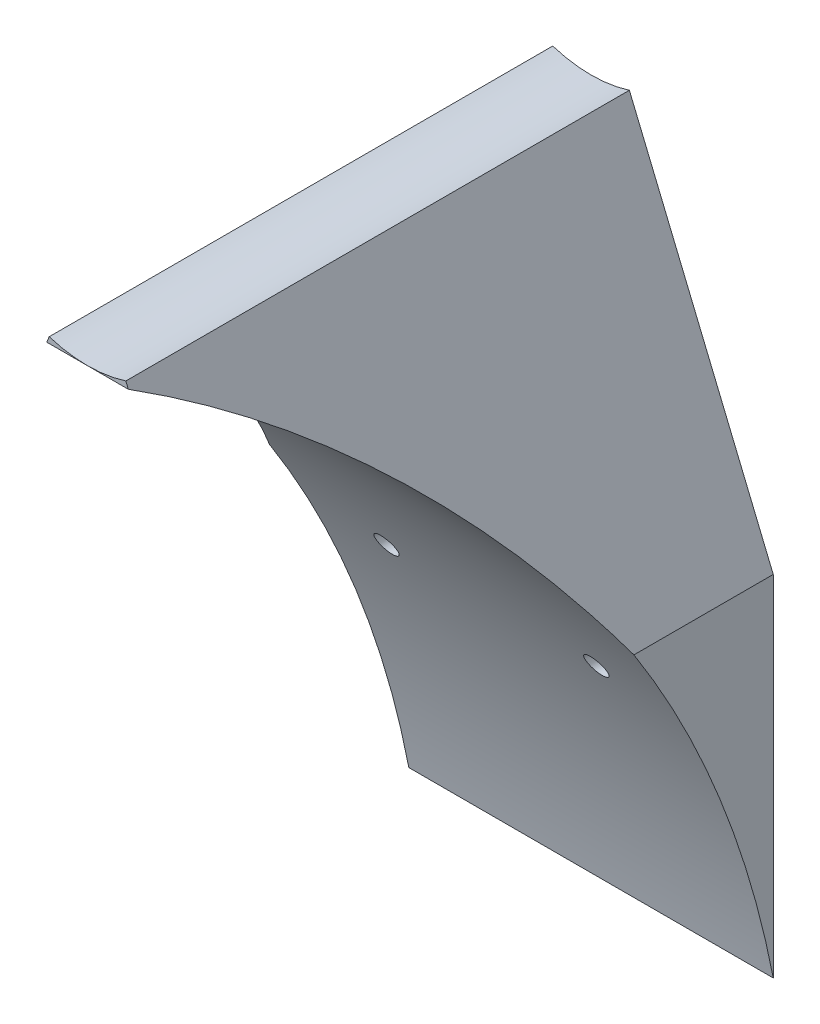
ISO-10303-21;
HEADER;
FILE_DESCRIPTION(('STEP AP214'),'2;1');
FILE_NAME('part.step','',(''),(''),'','','');
FILE_SCHEMA(('AUTOMOTIVE_DESIGN { 1 0 10303 214 1 1 1 1 }'));
ENDSEC;
DATA;
#1=APPLICATION_CONTEXT('core data for automotive mechanical design processes');
#2=APPLICATION_PROTOCOL_DEFINITION('international standard','automotive_design',2000,#1);
#3=PRODUCT_CONTEXT('',#1,'mechanical');
#4=PRODUCT('Part','Part','',(#3));
#5=PRODUCT_RELATED_PRODUCT_CATEGORY('part','',(#4));
#6=PRODUCT_DEFINITION_FORMATION('','',#4);
#7=PRODUCT_DEFINITION_CONTEXT('part definition',#1,'design');
#8=PRODUCT_DEFINITION('design','',#6,#7);
#9=PRODUCT_DEFINITION_SHAPE('','',#8);
#10=(LENGTH_UNIT() NAMED_UNIT(*) SI_UNIT(.MILLI.,.METRE.));
#11=(NAMED_UNIT(*) PLANE_ANGLE_UNIT() SI_UNIT($,.RADIAN.));
#12=(NAMED_UNIT(*) SI_UNIT($,.STERADIAN.) SOLID_ANGLE_UNIT());
#13=UNCERTAINTY_MEASURE_WITH_UNIT(LENGTH_MEASURE(1.E-05),#10,'distance_accuracy_value','');
#14=(GEOMETRIC_REPRESENTATION_CONTEXT(3) GLOBAL_UNCERTAINTY_ASSIGNED_CONTEXT((#13)) GLOBAL_UNIT_ASSIGNED_CONTEXT((#10,
#11,#12)) REPRESENTATION_CONTEXT('',''));
#15=CARTESIAN_POINT('',(0.,0.,0.));
#16=DIRECTION('',(0.,0.,1.));
#17=DIRECTION('',(1.,0.,0.));
#18=AXIS2_PLACEMENT_3D('',#15,#16,#17);
#19=CARTESIAN_POINT('',(0.,0.,76.2));
#20=DIRECTION('',(0.,0.,1.));
#21=DIRECTION('',(1.,0.,0.));
#22=AXIS2_PLACEMENT_3D('',#19,#20,#21);
#23=PLANE('',#22);
#24=CARTESIAN_POINT('',(0.,0.,76.2));
#25=DIRECTION('',(0.,0.,1.));
#26=DIRECTION('',(1.,0.,0.));
#27=AXIS2_PLACEMENT_3D('',#24,#25,#26);
#28=CIRCLE('',#27,19.05);
#29=CARTESIAN_POINT('',(0.,-19.05,76.2));
#30=VERTEX_POINT('',#29);
#31=CARTESIAN_POINT('',(-5.79810361486857,-18.1461977965426,76.2));
#32=VERTEX_POINT('',#31);
#33=EDGE_CURVE('E101',#30,#32,#28,.F.);
#34=ORIENTED_EDGE('',*,*,#33,.T.);
#35=DIRECTION('',(-0.382683432365091,-0.923879532511286,0.));
#36=VECTOR('',#35,1.);
#37=CARTESIAN_POINT('',(0.,-4.14833741348245,76.2));
#38=LINE('',#37,#36);
#39=CARTESIAN_POINT('',(-6.1724707452433,-19.05,76.2));
#40=VERTEX_POINT('',#39);
#41=EDGE_CURVE('E110',#32,#40,#38,.T.);
#42=ORIENTED_EDGE('',*,*,#41,.T.);
#43=DIRECTION('',(-1.,0.,0.));
#44=VECTOR('',#43,1.);
#45=CARTESIAN_POINT('',(156.950665084076,-19.05,76.2));
#46=LINE('',#45,#44);
#47=EDGE_CURVE('E186',#30,#40,#46,.T.);
#48=ORIENTED_EDGE('',*,*,#47,.F.);
#49=EDGE_LOOP('',(#34,#42,#48));
#50=FACE_BOUND('',#49,.T.);
#51=ADVANCED_FACE('F33',(#50),#23,.T.);
#52=CARTESIAN_POINT('',(27.5729775462199,-123.606903323708,76.2));
#53=DIRECTION('',(-1.,0.,0.));
#54=DIRECTION('',(0.,0.,1.));
#55=AXIS2_PLACEMENT_3D('',#52,#53,#54);
#56=PLANE('',#55);
#57=CARTESIAN_POINT('',(27.5729775462199,-152.600603318377,149.616594536232));
#58=DIRECTION('',(-1.,0.,0.));
#59=DIRECTION('',(0.,0.,1.));
#60=AXIS2_PLACEMENT_3D('',#57,#58,#59);
#61=CIRCLE('',#60,152.4);
#62=CARTESIAN_POINT('',(27.5729775462199,-70.7153937605752,21.0842155196007));
#63=VERTEX_POINT('',#62);
#64=CARTESIAN_POINT('',(27.5729775462199,-123.606903323708,0.));
#65=VERTEX_POINT('',#64);
#66=EDGE_CURVE('E190',#63,#65,#61,.T.);
#67=ORIENTED_EDGE('',*,*,#66,.T.);
#68=DIRECTION('',(0.,1.,0.));
#69=VECTOR('',#68,1.);
#70=CARTESIAN_POINT('',(27.5729775462199,-123.606903323708,0.));
#71=LINE('',#70,#69);
#72=CARTESIAN_POINT('',(27.5729775462199,-70.7153937605752,0.));
#73=VERTEX_POINT('',#72);
#74=EDGE_CURVE('E120',#65,#73,#71,.T.);
#75=ORIENTED_EDGE('',*,*,#74,.T.);
#76=DIRECTION('',(0.,0.,-1.));
#77=VECTOR('',#76,1.);
#78=CARTESIAN_POINT('',(27.5729775462199,-70.7153937605752,76.2));
#79=LINE('',#78,#77);
#80=EDGE_CURVE('E11',#63,#73,#79,.T.);
#81=ORIENTED_EDGE('',*,*,#80,.F.);
#82=EDGE_LOOP('',(#67,#75,#81));
#83=FACE_BOUND('',#82,.T.);
#84=ADVANCED_FACE('F35',(#83),#56,.F.);
#85=CARTESIAN_POINT('',(0.,-4.14833741348245,76.2));
#86=DIRECTION('',(-0.923879532511286,-0.382683432365091,0.));
#87=DIRECTION('',(0.382683432365091,-0.923879532511287,0.));
#88=AXIS2_PLACEMENT_3D('',#85,#86,#87);
#89=PLANE('',#88);
#90=DIRECTION('',(-0.382683432365091,0.923879532511287,0.));
#91=VECTOR('',#90,1.);
#92=CARTESIAN_POINT('',(0.,-4.14833741348245,0.));
#93=LINE('',#92,#91);
#94=CARTESIAN_POINT('',(5.79810361486859,-18.1461977965426,0.));
#95=VERTEX_POINT('',#94);
#96=EDGE_CURVE('E116',#73,#95,#93,.T.);
#97=ORIENTED_EDGE('',*,*,#96,.T.);
#98=DIRECTION('',(0.,0.,-1.));
#99=VECTOR('',#98,1.);
#100=CARTESIAN_POINT('',(5.79810361486859,-18.1461977965426,76.201));
#101=LINE('',#100,#99);
#102=CARTESIAN_POINT('',(5.79810361486859,-18.1461977965426,76.2));
#103=VERTEX_POINT('',#102);
#104=EDGE_CURVE('E55',#103,#95,#101,.T.);
#105=ORIENTED_EDGE('',*,*,#104,.F.);
#106=DIRECTION('',(-0.382683432365091,0.923879532511287,0.));
#107=VECTOR('',#106,1.);
#108=CARTESIAN_POINT('',(0.,-4.14833741348245,76.2));
#109=LINE('',#108,#107);
#110=CARTESIAN_POINT('',(6.17247074524332,-19.05,76.2));
#111=VERTEX_POINT('',#110);
#112=EDGE_CURVE('E118',#111,#103,#109,.T.);
#113=ORIENTED_EDGE('',*,*,#112,.F.);
#114=CARTESIAN_POINT('',(61.4909419028246,-152.600603318377,149.616594536232));
#115=DIRECTION('',(-0.923879532511286,-0.382683432365091,0.));
#116=DIRECTION('',(-0.382683432365091,0.923879532511287,0.));
#117=AXIS2_PLACEMENT_3D('',#114,#115,#116);
#118=ELLIPSE('',#117,164.956571324561,152.4);
#119=EDGE_CURVE('E189',#63,#111,#118,.F.);
#120=ORIENTED_EDGE('',*,*,#119,.F.);
#121=ORIENTED_EDGE('',*,*,#80,.T.);
#122=EDGE_LOOP('',(#97,#105,#113,#120,#121));
#123=FACE_BOUND('',#122,.T.);
#124=ADVANCED_FACE('F162',(#123),#89,.F.);
#125=CARTESIAN_POINT('',(-27.5729775462199,-70.7153937605752,76.2));
#126=DIRECTION('',(1.,0.,0.));
#127=DIRECTION('',(0.,1.,0.));
#128=AXIS2_PLACEMENT_3D('',#125,#126,#127);
#129=PLANE('',#128);
#130=CARTESIAN_POINT('',(-27.5729775462199,-152.600603318377,149.616594536232));
#131=DIRECTION('',(1.,0.,0.));
#132=DIRECTION('',(0.,1.,0.));
#133=AXIS2_PLACEMENT_3D('',#130,#131,#132);
#134=CIRCLE('',#133,152.4);
#135=CARTESIAN_POINT('',(-27.5729775462199,-123.606903323708,0.));
#136=VERTEX_POINT('',#135);
#137=CARTESIAN_POINT('',(-27.5729775462199,-70.7153937605753,21.0842155196007));
#138=VERTEX_POINT('',#137);
#139=EDGE_CURVE('E63',#136,#138,#134,.T.);
#140=ORIENTED_EDGE('',*,*,#139,.T.);
#141=DIRECTION('',(0.,0.,-1.));
#142=VECTOR('',#141,1.);
#143=CARTESIAN_POINT('',(-27.5729775462199,-70.7153937605752,76.2));
#144=LINE('',#143,#142);
#145=CARTESIAN_POINT('',(-27.5729775462199,-70.7153937605752,0.));
#146=VERTEX_POINT('',#145);
#147=EDGE_CURVE('E47',#138,#146,#144,.T.);
#148=ORIENTED_EDGE('',*,*,#147,.T.);
#149=DIRECTION('',(0.,-1.,0.));
#150=VECTOR('',#149,1.);
#151=CARTESIAN_POINT('',(-27.5729775462199,-70.7153937605752,0.));
#152=LINE('',#151,#150);
#153=EDGE_CURVE('E115',#146,#136,#152,.T.);
#154=ORIENTED_EDGE('',*,*,#153,.T.);
#155=EDGE_LOOP('',(#140,#148,#154));
#156=FACE_BOUND('',#155,.T.);
#157=ADVANCED_FACE('F166',(#156),#129,.F.);
#158=EDGE_CURVE('E178',#103,#30,#28,.F.);
#159=ORIENTED_EDGE('',*,*,#158,.T.);
#160=EDGE_CURVE('E181',#111,#30,#46,.T.);
#161=ORIENTED_EDGE('',*,*,#160,.F.);
#162=ORIENTED_EDGE('',*,*,#112,.T.);
#163=EDGE_LOOP('',(#159,#161,#162));
#164=FACE_BOUND('',#163,.T.);
#165=ADVANCED_FACE('F158',(#164),#23,.T.);
#166=CARTESIAN_POINT('',(0.,-4.14833741348245,76.2));
#167=DIRECTION('',(0.923879532511286,-0.382683432365091,0.));
#168=DIRECTION('',(0.382683432365091,0.923879532511287,0.));
#169=AXIS2_PLACEMENT_3D('',#166,#167,#168);
#170=PLANE('',#169);
#171=ORIENTED_EDGE('',*,*,#41,.F.);
#172=DIRECTION('',(0.,0.,-1.));
#173=VECTOR('',#172,1.);
#174=CARTESIAN_POINT('',(-5.79810361486857,-18.1461977965426,76.201));
#175=LINE('',#174,#173);
#176=CARTESIAN_POINT('',(-5.79810361486857,-18.1461977965426,0.));
#177=VERTEX_POINT('',#176);
#178=EDGE_CURVE('E95',#177,#32,#175,.F.);
#179=ORIENTED_EDGE('',*,*,#178,.F.);
#180=DIRECTION('',(-0.382683432365091,-0.923879532511286,0.));
#181=VECTOR('',#180,1.);
#182=CARTESIAN_POINT('',(0.,-4.14833741348245,0.));
#183=LINE('',#182,#181);
#184=EDGE_CURVE('E107',#177,#146,#183,.T.);
#185=ORIENTED_EDGE('',*,*,#184,.T.);
#186=ORIENTED_EDGE('',*,*,#147,.F.);
#187=CARTESIAN_POINT('',(-61.4909419028246,-152.600603318377,149.616594536232));
#188=DIRECTION('',(0.923879532511286,-0.382683432365091,0.));
#189=DIRECTION('',(-0.382683432365091,-0.923879532511287,0.));
#190=AXIS2_PLACEMENT_3D('',#187,#188,#189);
#191=ELLIPSE('',#190,164.956571324561,152.4);
#192=EDGE_CURVE('E192',#40,#138,#191,.F.);
#193=ORIENTED_EDGE('',*,*,#192,.F.);
#194=EDGE_LOOP('',(#171,#179,#185,#186,#193));
#195=FACE_BOUND('',#194,.T.);
#196=ADVANCED_FACE('F105',(#195),#170,.F.);
#197=CARTESIAN_POINT('',(0.,0.,0.));
#198=DIRECTION('',(0.,0.,1.));
#199=DIRECTION('',(1.,0.,0.));
#200=AXIS2_PLACEMENT_3D('',#197,#198,#199);
#201=PLANE('',#200);
#202=CARTESIAN_POINT('',(15.875,-81.009177720799,0.));
#203=DIRECTION('',(0.,0.,-1.));
#204=DIRECTION('',(-1.,0.,0.));
#205=AXIS2_PLACEMENT_3D('',#202,#203,#204);
#206=CIRCLE('',#205,1.69999999999999);
#207=CARTESIAN_POINT('',(14.175,-81.009177720799,0.));
#208=VERTEX_POINT('',#207);
#209=EDGE_CURVE('E183',#208,#208,#206,.T.);
#210=ORIENTED_EDGE('',*,*,#209,.F.);
#211=EDGE_LOOP('',(#210));
#212=FACE_BOUND('',#211,.T.);
#213=CARTESIAN_POINT('',(-15.875,-81.009177720799,0.));
#214=DIRECTION('',(0.,0.,-1.));
#215=DIRECTION('',(-1.,0.,0.));
#216=AXIS2_PLACEMENT_3D('',#213,#214,#215);
#217=CIRCLE('',#216,1.69999999999999);
#218=CARTESIAN_POINT('',(-17.575,-81.009177720799,0.));
#219=VERTEX_POINT('',#218);
#220=EDGE_CURVE('E209',#219,#219,#217,.T.);
#221=ORIENTED_EDGE('',*,*,#220,.F.);
#222=EDGE_LOOP('',(#221));
#223=FACE_BOUND('',#222,.T.);
#224=CARTESIAN_POINT('',(0.,-38.1,0.));
#225=DIRECTION('',(0.,0.,-1.));
#226=DIRECTION('',(-1.,0.,0.));
#227=AXIS2_PLACEMENT_3D('',#224,#225,#226);
#228=CIRCLE('',#227,1.69999999999999);
#229=CARTESIAN_POINT('',(-1.69999999999999,-38.1,0.));
#230=VERTEX_POINT('',#229);
#231=EDGE_CURVE('E131',#230,#230,#228,.T.);
#232=ORIENTED_EDGE('',*,*,#231,.F.);
#233=EDGE_LOOP('',(#232));
#234=FACE_BOUND('',#233,.T.);
#235=ORIENTED_EDGE('',*,*,#184,.F.);
#236=CARTESIAN_POINT('',(0.,0.,0.));
#237=DIRECTION('',(0.,0.,-1.));
#238=DIRECTION('',(-1.,0.,0.));
#239=AXIS2_PLACEMENT_3D('',#236,#237,#238);
#240=CIRCLE('',#239,19.05);
#241=EDGE_CURVE('E92',#95,#177,#240,.T.);
#242=ORIENTED_EDGE('',*,*,#241,.F.);
#243=ORIENTED_EDGE('',*,*,#96,.F.);
#244=ORIENTED_EDGE('',*,*,#74,.F.);
#245=DIRECTION('',(1.,0.,0.));
#246=VECTOR('',#245,1.);
#247=CARTESIAN_POINT('',(27.5729775462199,-123.606903323708,0.));
#248=LINE('',#247,#246);
#249=EDGE_CURVE('E198',#136,#65,#248,.T.);
#250=ORIENTED_EDGE('',*,*,#249,.F.);
#251=ORIENTED_EDGE('',*,*,#153,.F.);
#252=EDGE_LOOP('',(#235,#242,#243,#244,#250,#251));
#253=FACE_BOUND('',#252,.T.);
#254=ADVANCED_FACE('F113',(#212,#223,#234,#253),#201,.F.);
#255=CARTESIAN_POINT('',(156.950665084076,-152.600603318377,149.616594536232));
#256=DIRECTION('',(-1.,0.,0.));
#257=DIRECTION('',(0.,0.,1.));
#258=AXIS2_PLACEMENT_3D('',#255,#256,#257);
#259=CYLINDRICAL_SURFACE('',#258,152.4);
#260=CARTESIAN_POINT('',(14.175,-81.009177720799,15.0787642396699));
#261=CARTESIAN_POINT('',(14.1750029242029,-81.1144739274015,15.0227333509897));
#262=CARTESIAN_POINT('',(14.1847960071335,-81.2199270497482,14.9667787525406));
#263=CARTESIAN_POINT('',(14.224040753075,-81.4282126871258,14.8565680395199));
#264=CARTESIAN_POINT('',(14.2535227408848,-81.5310409052515,14.8023146803513));
#265=CARTESIAN_POINT('',(14.3321566466168,-81.7311292780614,14.6970242162137));
#266=CARTESIAN_POINT('',(14.3813620221467,-81.8283734723424,14.6459962920792));
#267=CARTESIAN_POINT('',(14.498951340568,-82.0134124243223,14.5491321888724));
#268=CARTESIAN_POINT('',(14.5673223733839,-82.1012134880598,14.5032925440286));
#269=CARTESIAN_POINT('',(14.7161997309736,-82.2573466237785,14.4219444376987));
#270=CARTESIAN_POINT('',(14.7954011277931,-82.3266478347235,14.3859174240421));
#271=CARTESIAN_POINT('',(14.9673618396801,-82.4504915840453,14.3216326676203));
#272=CARTESIAN_POINT('',(15.0601081478946,-82.5050481396747,14.2933675454693));
#273=CARTESIAN_POINT('',(15.2442214980523,-82.5906776087829,14.249049131312));
#274=CARTESIAN_POINT('',(15.3343780107988,-82.6238027229844,14.2319271036912));
#275=CARTESIAN_POINT('',(15.520068628377,-82.674489335104,14.205740417077));
#276=CARTESIAN_POINT('',(15.6155986601863,-82.692062456469,14.1966697405467));
#277=CARTESIAN_POINT('',(15.7992640398198,-82.709748213001,14.1875413207138));
#278=CARTESIAN_POINT('',(15.8872164578571,-82.711390898664,14.1866937764669));
#279=CARTESIAN_POINT('',(16.0620992220723,-82.7011173477291,14.1919959751033));
#280=CARTESIAN_POINT('',(16.1490297928792,-82.6892041495994,14.1981441499392));
#281=CARTESIAN_POINT('',(16.3169471403417,-82.6529115909105,14.2168869372245));
#282=CARTESIAN_POINT('',(16.3980318380124,-82.6288864384253,14.2292983928597));
#283=CARTESIAN_POINT('',(16.5547906318136,-82.5695976337409,14.2599569072755));
#284=CARTESIAN_POINT('',(16.6304640235899,-82.5343325217582,14.2782047240514));
#285=CARTESIAN_POINT('',(16.7779911783855,-82.4521098380907,14.3208034287618));
#286=CARTESIAN_POINT('',(16.8495244354299,-82.4047012347754,14.3453900565955));
#287=CARTESIAN_POINT('',(16.9835810336693,-82.3007849460627,14.3993657445464));
#288=CARTESIAN_POINT('',(17.0461012956428,-82.24427416487,14.4287564386533));
#289=CARTESIAN_POINT('',(17.166693250954,-82.1181599454794,14.4944620589578));
#290=CARTESIAN_POINT('',(17.2237834779762,-82.0478234999093,14.5311690898016));
#291=CARTESIAN_POINT('',(17.32541075824,-81.9004313267112,14.6082518114383));
#292=CARTESIAN_POINT('',(17.3699422513143,-81.8233726426319,14.648629116755));
#293=CARTESIAN_POINT('',(17.4503862439093,-81.6555240050663,14.7367751781263));
#294=CARTESIAN_POINT('',(17.4847623444203,-81.5641651713328,14.7848641589191));
#295=CARTESIAN_POINT('',(17.5373347053157,-81.3779764499375,14.8831223726091));
#296=CARTESIAN_POINT('',(17.5555236270185,-81.2831450081844,14.9332925382634));
#297=CARTESIAN_POINT('',(17.5766077305878,-81.0834414441206,15.0392210320739));
#298=CARTESIAN_POINT('',(17.5779400061566,-80.9784490009793,15.0950684529594));
#299=CARTESIAN_POINT('',(17.5613109964467,-80.7697626910737,15.2063853382147));
#300=CARTESIAN_POINT('',(17.5433429531716,-80.6660692920344,15.2618546633486));
#301=CARTESIAN_POINT('',(17.4873688609481,-80.4595706321365,15.3726168224217));
#302=CARTESIAN_POINT('',(17.4487446559997,-80.3568981237017,15.4278481240378));
#303=CARTESIAN_POINT('',(17.3514104995777,-80.1592743967888,15.5344314133518));
#304=CARTESIAN_POINT('',(17.2927024442362,-80.0643224504534,15.5857837667057));
#305=CARTESIAN_POINT('',(17.1595997904025,-79.8906381756227,15.679929580075));
#306=CARTESIAN_POINT('',(17.0862046288575,-79.8113120478311,15.7230328578508));
#307=CARTESIAN_POINT('',(16.9234260954204,-79.6665574068198,15.8018279905939));
#308=CARTESIAN_POINT('',(16.8340585602722,-79.6011152668089,15.8375271117798));
#309=CARTESIAN_POINT('',(16.6534911709436,-79.4947239210252,15.8956401712988));
#310=CARTESIAN_POINT('',(16.5638254028489,-79.4517677555979,15.9191397257834));
#311=CARTESIAN_POINT('',(16.3767384812768,-79.3818494395246,15.9574171844835));
#312=CARTESIAN_POINT('',(16.2793255607583,-79.3548705606459,15.9722042106407));
#313=CARTESIAN_POINT('',(16.0926130150729,-79.3208296531136,15.990866862865));
#314=CARTESIAN_POINT('',(16.0037934077736,-79.3117225097397,15.9958627983235));
#315=CARTESIAN_POINT('',(15.8257392251963,-79.307563269705,15.9981441210591));
#316=CARTESIAN_POINT('',(15.7365048221492,-79.3125057834676,15.9954324650385));
#317=CARTESIAN_POINT('',(15.5653913347204,-79.3355045068044,15.9828209327373));
#318=CARTESIAN_POINT('',(15.4833794887163,-79.3528145229176,15.9733300870063));
#319=CARTESIAN_POINT('',(15.3236792973039,-79.3989124018042,15.9480749352758));
#320=CARTESIAN_POINT('',(15.2459912639084,-79.4277010916749,15.9323101772091));
#321=CARTESIAN_POINT('',(15.0943684904254,-79.4966405876915,15.8945985292576));
#322=CARTESIAN_POINT('',(15.0206287040622,-79.5371203361564,15.8724727615056));
#323=CARTESIAN_POINT('',(14.8810751812314,-79.6275004513031,15.8231384018259));
#324=CARTESIAN_POINT('',(14.8152636686212,-79.6774034511479,15.7959283892172));
#325=CARTESIAN_POINT('',(14.6867044894829,-79.7901848593191,15.7345290543982));
#326=CARTESIAN_POINT('',(14.6248447825759,-79.8538462155715,15.6999219270605));
#327=CARTESIAN_POINT('',(14.5125906900396,-79.988617086283,15.6267988843614));
#328=CARTESIAN_POINT('',(14.4622046949304,-80.0597319962519,15.5882801380767));
#329=CARTESIAN_POINT('',(14.3679844394175,-80.2165516958767,15.5035156159019));
#330=CARTESIAN_POINT('',(14.3256882252594,-80.3029795969882,15.4568994731842));
#331=CARTESIAN_POINT('',(14.2564928176548,-80.4804980930056,15.3613876920251));
#332=CARTESIAN_POINT('',(14.2295819737717,-80.5715851027441,15.3124938088073));
#333=CARTESIAN_POINT('',(14.1986293425488,-80.7208040172225,15.2325975873075));
#334=CARTESIAN_POINT('',(14.1897742764337,-80.7781639450568,15.2019321540231));
#335=CARTESIAN_POINT('',(14.1779586497913,-80.8933926473899,15.1404248728697));
#336=CARTESIAN_POINT('',(14.1749983915951,-80.9512614478347,15.1095830160336));
#337=CARTESIAN_POINT('',(14.175,-81.009177720799,15.0787642396699));
#338=B_SPLINE_CURVE_WITH_KNOTS('',3,(#260,#261,#262,#263,#264,#265,#266,#267,#268,#269,#270,
#271,#272,#273,#274,#275,#276,#277,#278,#279,#280,#281,#282,#283,#284,#285,#286,#287,#288,#289,
#290,#291,#292,#293,#294,#295,#296,#297,#298,#299,#300,#301,#302,#303,#304,#305,#306,#307,#308,
#309,#310,#311,#312,#313,#314,#315,#316,#317,#318,#319,#320,#321,#322,#323,#324,#325,#326,#327,
#328,#329,#330,#331,#332,#333,#334,#335,#336,#337),.UNSPECIFIED.,.T.,.F.,(4,2,2,2,2,2,2,2,2,2,2,
2,2,2,2,2,2,2,2,2,2,2,2,2,2,2,2,2,2,2,2,2,2,2,2,2,2,2,4),(0.,0.357597796085764,
0.715747637490718,1.07487483187911,1.43376069544458,1.7655669546436,2.09705665816813,
2.38813015201868,2.6789859154736,2.94159287826765,3.20414099091653,3.45942143146143,
3.71473503993143,3.98142655182399,4.24820896201909,4.54024746921098,4.83241506926513,
5.15750104684261,5.48273433167707,5.83792277023658,6.19323561839445,6.5598308195763,
6.92639141976381,7.27347180705871,7.62020995127619,7.92493450260988,8.22933944042212,
8.4962221724277,8.76300253960548,9.0149149133883,9.26684544202968,9.52670126239912,
9.78662980267828,10.0713006913256,10.3561790909138,10.6756429242777,10.9948645249472,
11.1915446344531,11.3882348309738),.UNSPECIFIED.);
#339=CARTESIAN_POINT('',(14.175,-81.009177720799,15.0787642396699));
#340=VERTEX_POINT('',#339);
#341=EDGE_CURVE('E37',#340,#340,#338,.T.);
#342=ORIENTED_EDGE('',*,*,#341,.F.);
#343=EDGE_LOOP('',(#342));
#344=FACE_BOUND('',#343,.T.);
#345=CARTESIAN_POINT('',(-17.575,-81.009177720799,15.0787642396699));
#346=CARTESIAN_POINT('',(-17.5749970757971,-81.1144739274015,15.0227333509897));
#347=CARTESIAN_POINT('',(-17.5652039928665,-81.2199270497482,14.9667787525406));
#348=CARTESIAN_POINT('',(-17.525959246925,-81.4282126871258,14.8565680395199));
#349=CARTESIAN_POINT('',(-17.4964772591152,-81.5310409052515,14.8023146803513));
#350=CARTESIAN_POINT('',(-17.4178433533832,-81.7311292780614,14.6970242162137));
#351=CARTESIAN_POINT('',(-17.3686379778533,-81.8283734723424,14.6459962920792));
#352=CARTESIAN_POINT('',(-17.251048659432,-82.0134124243223,14.5491321888724));
#353=CARTESIAN_POINT('',(-17.1826776266161,-82.1012134880598,14.5032925440286));
#354=CARTESIAN_POINT('',(-17.0338002690264,-82.2573466237785,14.4219444376987));
#355=CARTESIAN_POINT('',(-16.9545988722069,-82.3266478347235,14.3859174240421));
#356=CARTESIAN_POINT('',(-16.7826381603199,-82.4504915840453,14.3216326676203));
#357=CARTESIAN_POINT('',(-16.6898918521055,-82.5050481396747,14.2933675454693));
#358=CARTESIAN_POINT('',(-16.5057785019477,-82.5906776087829,14.249049131312));
#359=CARTESIAN_POINT('',(-16.4156219892012,-82.6238027229844,14.2319271036912));
#360=CARTESIAN_POINT('',(-16.229931371623,-82.674489335104,14.205740417077));
#361=CARTESIAN_POINT('',(-16.1344013398137,-82.692062456469,14.1966697405467));
#362=CARTESIAN_POINT('',(-15.9507359601802,-82.709748213001,14.1875413207138));
#363=CARTESIAN_POINT('',(-15.8627835421429,-82.711390898664,14.1866937764669));
#364=CARTESIAN_POINT('',(-15.6879007779277,-82.7011173477291,14.1919959751033));
#365=CARTESIAN_POINT('',(-15.6009702071208,-82.6892041495994,14.1981441499392));
#366=CARTESIAN_POINT('',(-15.4330528596583,-82.6529115909105,14.2168869372245));
#367=CARTESIAN_POINT('',(-15.3519681619876,-82.6288864384253,14.2292983928597));
#368=CARTESIAN_POINT('',(-15.1952093681864,-82.5695976337409,14.2599569072755));
#369=CARTESIAN_POINT('',(-15.1195359764101,-82.5343325217582,14.2782047240514));
#370=CARTESIAN_POINT('',(-14.9720088216145,-82.4521098380907,14.3208034287618));
#371=CARTESIAN_POINT('',(-14.9004755645701,-82.4047012347754,14.3453900565955));
#372=CARTESIAN_POINT('',(-14.7664189663307,-82.3007849460627,14.3993657445464));
#373=CARTESIAN_POINT('',(-14.7038987043572,-82.24427416487,14.4287564386533));
#374=CARTESIAN_POINT('',(-14.5833067490459,-82.1181599454794,14.4944620589579));
#375=CARTESIAN_POINT('',(-14.5262165220238,-82.0478234999093,14.5311690898017));
#376=CARTESIAN_POINT('',(-14.42458924176,-81.9004313267112,14.6082518114383));
#377=CARTESIAN_POINT('',(-14.3800577486857,-81.8233726426319,14.648629116755));
#378=CARTESIAN_POINT('',(-14.2996137560907,-81.6555240050663,14.7367751781263));
#379=CARTESIAN_POINT('',(-14.2652376555797,-81.5641651713328,14.7848641589191));
#380=CARTESIAN_POINT('',(-14.2126652946843,-81.3779764499375,14.883122372609));
#381=CARTESIAN_POINT('',(-14.1944763729814,-81.2831450081844,14.9332925382634));
#382=CARTESIAN_POINT('',(-14.1733922694122,-81.0834414441206,15.0392210320739));
#383=CARTESIAN_POINT('',(-14.1720599938434,-80.9784490009792,15.0950684529594));
#384=CARTESIAN_POINT('',(-14.1886890035533,-80.7697626910736,15.2063853382147));
#385=CARTESIAN_POINT('',(-14.2066570468284,-80.6660692920344,15.2618546633486));
#386=CARTESIAN_POINT('',(-14.2626311390519,-80.4595706321365,15.3726168224217));
#387=CARTESIAN_POINT('',(-14.3012553440003,-80.3568981237017,15.4278481240378));
#388=CARTESIAN_POINT('',(-14.3985895004223,-80.1592743967888,15.5344314133518));
#389=CARTESIAN_POINT('',(-14.4572975557638,-80.0643224504534,15.5857837667057));
#390=CARTESIAN_POINT('',(-14.5904002095975,-79.8906381756227,15.679929580075));
#391=CARTESIAN_POINT('',(-14.6637953711425,-79.8113120478311,15.7230328578508));
#392=CARTESIAN_POINT('',(-14.8265739045796,-79.6665574068198,15.8018279905939));
#393=CARTESIAN_POINT('',(-14.9159414397277,-79.601115266809,15.8375271117798));
#394=CARTESIAN_POINT('',(-15.0965088290564,-79.4947239210252,15.8956401712988));
#395=CARTESIAN_POINT('',(-15.1861745971511,-79.4517677555979,15.9191397257834));
#396=CARTESIAN_POINT('',(-15.3732615187232,-79.3818494395246,15.9574171844835));
#397=CARTESIAN_POINT('',(-15.4706744392417,-79.3548705606458,15.9722042106407));
#398=CARTESIAN_POINT('',(-15.6573869849271,-79.3208296531136,15.9908668628651));
#399=CARTESIAN_POINT('',(-15.7462065922264,-79.3117225097397,15.9958627983235));
#400=CARTESIAN_POINT('',(-15.9242607748037,-79.307563269705,15.9981441210591));
#401=CARTESIAN_POINT('',(-16.0134951778508,-79.3125057834676,15.9954324650385));
#402=CARTESIAN_POINT('',(-16.1846086652796,-79.3355045068044,15.9828209327373));
#403=CARTESIAN_POINT('',(-16.2666205112837,-79.3528145229176,15.9733300870063));
#404=CARTESIAN_POINT('',(-16.4263207026961,-79.3989124018042,15.9480749352758));
#405=CARTESIAN_POINT('',(-16.5040087360916,-79.4277010916749,15.9323101772091));
#406=CARTESIAN_POINT('',(-16.6556315095746,-79.4966405876915,15.8945985292576));
#407=CARTESIAN_POINT('',(-16.7293712959378,-79.5371203361564,15.8724727615056));
#408=CARTESIAN_POINT('',(-16.8689248187686,-79.6275004513031,15.8231384018259));
#409=CARTESIAN_POINT('',(-16.9347363313788,-79.6774034511479,15.7959283892172));
#410=CARTESIAN_POINT('',(-17.0632955105171,-79.7901848593191,15.7345290543982));
#411=CARTESIAN_POINT('',(-17.1251552174241,-79.8538462155715,15.6999219270605));
#412=CARTESIAN_POINT('',(-17.2374093099604,-79.988617086283,15.6267988843614));
#413=CARTESIAN_POINT('',(-17.2877953050696,-80.0597319962519,15.5882801380767));
#414=CARTESIAN_POINT('',(-17.3820155605825,-80.2165516958767,15.5035156159019));
#415=CARTESIAN_POINT('',(-17.4243117747406,-80.3029795969882,15.4568994731842));
#416=CARTESIAN_POINT('',(-17.4935071823452,-80.4804980930056,15.3613876920251));
#417=CARTESIAN_POINT('',(-17.5204180262283,-80.5715851027441,15.3124938088073));
#418=CARTESIAN_POINT('',(-17.5513706574512,-80.7208040172225,15.2325975873075));
#419=CARTESIAN_POINT('',(-17.5602257235663,-80.7781639450568,15.2019321540231));
#420=CARTESIAN_POINT('',(-17.5720413502087,-80.8933926473899,15.1404248728697));
#421=CARTESIAN_POINT('',(-17.5750016084049,-80.9512614478347,15.1095830160336));
#422=CARTESIAN_POINT('',(-17.575,-81.009177720799,15.0787642396699));
#423=B_SPLINE_CURVE_WITH_KNOTS('',3,(#345,#346,#347,#348,#349,#350,#351,#352,#353,#354,#355,
#356,#357,#358,#359,#360,#361,#362,#363,#364,#365,#366,#367,#368,#369,#370,#371,#372,#373,#374,
#375,#376,#377,#378,#379,#380,#381,#382,#383,#384,#385,#386,#387,#388,#389,#390,#391,#392,#393,
#394,#395,#396,#397,#398,#399,#400,#401,#402,#403,#404,#405,#406,#407,#408,#409,#410,#411,#412,
#413,#414,#415,#416,#417,#418,#419,#420,#421,#422),.UNSPECIFIED.,.T.,.F.,(4,2,2,2,2,2,2,2,2,2,2,
2,2,2,2,2,2,2,2,2,2,2,2,2,2,2,2,2,2,2,2,2,2,2,2,2,2,2,4),(0.,0.357597796085764,
0.715747637490718,1.07487483187911,1.43376069544458,1.7655669546436,2.09705665816813,
2.38813015201868,2.6789859154736,2.94159287826766,3.20414099091654,3.45942143146143,
3.71473503993143,3.981426551824,4.2482089620191,4.54024746921101,4.83241506926514,
5.15750104684262,5.48273433167709,5.83792277023661,6.19323561839445,6.5598308195763,
6.92639141976381,7.2734718070587,7.62020995127618,7.92493450260989,8.22933944042213,
8.4962221724277,8.76300253960549,9.0149149133883,9.26684544202968,9.52670126239912,
9.78662980267828,10.0713006913256,10.3561790909138,10.6756429242777,10.9948645249472,
11.1915446344531,11.3882348309738),.UNSPECIFIED.);
#424=CARTESIAN_POINT('',(-17.575,-81.009177720799,15.0787642396699));
#425=VERTEX_POINT('',#424);
#426=EDGE_CURVE('E132',#425,#425,#423,.T.);
#427=ORIENTED_EDGE('',*,*,#426,.F.);
#428=EDGE_LOOP('',(#427));
#429=FACE_BOUND('',#428,.T.);
#430=CARTESIAN_POINT('',(-1.69999999999999,-38.1,49.0413896409513));
#431=CARTESIAN_POINT('',(-1.7000005709837,-38.1694536804114,48.9623195872997));
#432=CARTESIAN_POINT('',(-1.69574972287771,-38.2390019703188,48.8833073834165));
#433=CARTESIAN_POINT('',(-1.67860115904989,-38.377838680853,48.7259058652956));
#434=CARTESIAN_POINT('',(-1.66569769983869,-38.4471268981064,48.6475169998165));
#435=CARTESIAN_POINT('',(-1.63091443731955,-38.5849478741439,48.4919134747797));
#436=CARTESIAN_POINT('',(-1.60902611115177,-38.6534798520183,48.4147000024949));
#437=CARTESIAN_POINT('',(-1.55581127147605,-38.789019381415,48.2622963678712));
#438=CARTESIAN_POINT('',(-1.52449150770584,-38.8560279863972,48.1871048003099));
#439=CARTESIAN_POINT('',(-1.44391445028471,-39.0019321961672,48.0236994635057));
#440=CARTESIAN_POINT('',(-1.3922480248308,-39.0802848243978,47.9361630300613));
#441=CARTESIAN_POINT('',(-1.2725223135681,-39.2313494013399,47.7677605021256));
#442=CARTESIAN_POINT('',(-1.20449611447883,-39.3040723482712,47.6868813811888));
#443=CARTESIAN_POINT('',(-1.06990709835889,-39.4233316863581,47.5545005610473));
#444=CARTESIAN_POINT('',(-1.00733035250084,-39.4718377031471,47.5007440730041));
#445=CARTESIAN_POINT('',(-0.871615990708929,-39.561810245282,47.4011566537522));
#446=CARTESIAN_POINT('',(-0.798493264623345,-39.6032865192563,47.3553147451771));
#447=CARTESIAN_POINT('',(-0.659854723680042,-39.6681316595068,47.2837130443675));
#448=CARTESIAN_POINT('',(-0.59640644522613,-39.6934728901558,47.255757597778));
#449=CARTESIAN_POINT('',(-0.464168980461592,-39.7368799983748,47.2078985900484));
#450=CARTESIAN_POINT('',(-0.395383857697504,-39.7549513477274,47.1879889730454));
#451=CARTESIAN_POINT('',(-0.253482252269466,-39.7825586462251,47.1575820798906));
#452=CARTESIAN_POINT('',(-0.180336735405885,-39.7920284440356,47.1471577504961));
#453=CARTESIAN_POINT('',(-0.0327034462412502,-39.8012905643078,47.1369619406816));
#454=CARTESIAN_POINT('',(0.0417836006715647,-39.8010879685359,47.1371848663139));
#455=CARTESIAN_POINT('',(0.180490043749523,-39.7916495419032,47.1475749305508));
#456=CARTESIAN_POINT('',(0.244879174593487,-39.7834882420536,47.1565591759585));
#457=CARTESIAN_POINT('',(0.370834250980346,-39.7602965863124,47.1821009729678));
#458=CARTESIAN_POINT('',(0.432399662940533,-39.7452649380049,47.1986599494904));
#459=CARTESIAN_POINT('',(0.553984607017075,-39.7085102772816,47.2391746659435));
#460=CARTESIAN_POINT('',(0.613832531887944,-39.6865343012773,47.2634101364203));
#461=CARTESIAN_POINT('',(0.728432334348259,-39.6372974861434,47.317753460652));
#462=CARTESIAN_POINT('',(0.783181552467498,-39.6100339116186,47.3478643539464));
#463=CARTESIAN_POINT('',(0.918500986303177,-39.5336977461473,47.4322527024008));
#464=CARTESIAN_POINT('',(0.994928634160641,-39.481334284184,47.4902124964386));
#465=CARTESIAN_POINT('',(1.13447570169874,-39.3692576007558,47.6144895836737));
#466=CARTESIAN_POINT('',(1.19755814850096,-39.3095246677537,47.6808293029406));
#467=CARTESIAN_POINT('',(1.33733453092882,-39.1567082055424,47.8508786499499));
#468=CARTESIAN_POINT('',(1.40706712580204,-39.0608620354661,47.9578075986426));
#469=CARTESIAN_POINT('',(1.52323303961965,-38.8634758001331,48.1786929034646));
#470=CARTESIAN_POINT('',(1.56963450416278,-38.7619281595721,48.2926586301074));
#471=CARTESIAN_POINT('',(1.62929818978367,-38.5905374841647,48.4856123177173));
#472=CARTESIAN_POINT('',(1.64845422446025,-38.5214620351539,48.5635366313003));
#473=CARTESIAN_POINT('',(1.67784585139504,-38.3826173690099,48.7204962227251));
#474=CARTESIAN_POINT('',(1.68807851022002,-38.3128479313553,48.7995318572283));
#475=CARTESIAN_POINT('',(1.69988134324279,-38.1730332455853,48.9582495351115));
#476=CARTESIAN_POINT('',(1.70143558532216,-38.1029877262825,49.037932498603));
#477=CARTESIAN_POINT('',(1.69593061734365,-37.9632106108204,49.1972765553569));
#478=CARTESIAN_POINT('',(1.68887148785214,-37.8934790117309,49.2769376488169));
#479=CARTESIAN_POINT('',(1.66594822254617,-37.7540852554724,49.4365135522556));
#480=CARTESIAN_POINT('',(1.64999476608251,-37.6844311035779,49.5164226235012));
#481=CARTESIAN_POINT('',(1.60895521745094,-37.5464223615744,49.6750791382212));
#482=CARTESIAN_POINT('',(1.58386597127822,-37.4780682288649,49.7538261707367));
#483=CARTESIAN_POINT('',(1.52420051773183,-37.3435549165053,49.9091058229625));
#484=CARTESIAN_POINT('',(1.4896570720641,-37.2773890255277,49.985645098871));
#485=CARTESIAN_POINT('',(1.41041263362751,-37.1479009395241,50.1357254284261));
#486=CARTESIAN_POINT('',(1.3657219807329,-37.0845759278023,50.2092694448526));
#487=CARTESIAN_POINT('',(1.26534804191288,-36.9619453665646,50.3519501797496));
#488=CARTESIAN_POINT('',(1.20968022861555,-36.9026343155264,50.4210929225331));
#489=CARTESIAN_POINT('',(1.08628312445312,-36.7896670769569,50.5530060867823));
#490=CARTESIAN_POINT('',(1.01856756671948,-36.7360045604064,50.6157836372992));
#491=CARTESIAN_POINT('',(0.885324402948217,-36.6469885446394,50.7200681421075));
#492=CARTESIAN_POINT('',(0.822170159995647,-36.6101334585443,50.7633014648307));
#493=CARTESIAN_POINT('',(0.68757844772445,-36.5434491035876,50.8415997505252));
#494=CARTESIAN_POINT('',(0.616153547676507,-36.5136093770191,50.8766768709757));
#495=CARTESIAN_POINT('',(0.48179566443287,-36.4685048569018,50.9297328987438));
#496=CARTESIAN_POINT('',(0.420266245060096,-36.4514918505148,50.9497594772586));
#497=CARTESIAN_POINT('',(0.293687272613608,-36.4243134510231,50.981762358356));
#498=CARTESIAN_POINT('',(0.228640675125323,-36.4141424021474,50.9937453100286));
#499=CARTESIAN_POINT('',(0.0964432150092802,-36.4014343786106,51.0087183759145));
#500=CARTESIAN_POINT('',(0.0292838558825584,-36.3989337334387,51.0116656944393));
#501=CARTESIAN_POINT('',(-0.104611903279584,-36.4019008270175,51.0081692179841));
#502=CARTESIAN_POINT('',(-0.171348279242849,-36.4073690152603,51.0017248932566));
#503=CARTESIAN_POINT('',(-0.297679421770857,-36.4251344203414,50.9807968165039));
#504=CARTESIAN_POINT('',(-0.357447447675466,-36.4369280413563,50.9669059530604));
#505=CARTESIAN_POINT('',(-0.473547467964253,-36.4661874512318,50.9324622706293));
#506=CARTESIAN_POINT('',(-0.529878028745585,-36.483655587716,50.9119066943667));
#507=CARTESIAN_POINT('',(-0.661644902709283,-36.5318688759,50.8552114822796));
#508=CARTESIAN_POINT('',(-0.734923227249268,-36.5650957589301,50.8161684595709));
#509=CARTESIAN_POINT('',(-0.872316178174602,-36.6387764714334,50.7296997538978));
#510=CARTESIAN_POINT('',(-0.936410366086028,-36.6792459823905,50.6822558841237));
#511=CARTESIAN_POINT('',(-1.08306809239465,-36.7852729024774,50.5581342342477));
#512=CARTESIAN_POINT('',(-1.16056835883113,-36.8538083428119,50.4780468547067));
#513=CARTESIAN_POINT('',(-1.29834429905817,-36.9980543845301,50.3098825791312));
#514=CARTESIAN_POINT('',(-1.35857740961064,-37.0737821139625,50.2217866336177));
#515=CARTESIAN_POINT('',(-1.44935297547728,-37.2088826622308,50.0650075521555));
#516=CARTESIAN_POINT('',(-1.48352529321228,-37.2671897958587,49.9974603537336));
#517=CARTESIAN_POINT('',(-1.54406046300146,-37.3856436029284,49.8604855280177));
#518=CARTESIAN_POINT('',(-1.57041907498109,-37.4457912556623,49.7910569019947));
#519=CARTESIAN_POINT('',(-1.63829838633443,-37.6280091290207,49.5811173584341));
#520=CARTESIAN_POINT('',(-1.6688022446177,-37.7521331086442,49.4386290081989));
#521=CARTESIAN_POINT('',(-1.69021850194095,-37.9141249799581,49.2533796855863));
#522=CARTESIAN_POINT('',(-1.69388571703034,-37.9512159297605,49.2110112196545));
#523=CARTESIAN_POINT('',(-1.69877652668664,-38.0255288341606,49.1262195084314));
#524=CARTESIAN_POINT('',(-1.69999969377171,-38.0627508105354,49.0837962548556));
#525=CARTESIAN_POINT('',(-1.69999999999999,-38.1,49.0413896409513));
#526=B_SPLINE_CURVE_WITH_KNOTS('',3,(#430,#431,#432,#433,#434,#435,#436,#437,#438,#439,#440,
#441,#442,#443,#444,#445,#446,#447,#448,#449,#450,#451,#452,#453,#454,#455,#456,#457,#458,#459,
#460,#461,#462,#463,#464,#465,#466,#467,#468,#469,#470,#471,#472,#473,#474,#475,#476,#477,#478,
#479,#480,#481,#482,#483,#484,#485,#486,#487,#488,#489,#490,#491,#492,#493,#494,#495,#496,#497,
#498,#499,#500,#501,#502,#503,#504,#505,#506,#507,#508,#509,#510,#511,#512,#513,#514,#515,#516,
#517,#518,#519,#520,#521,#522,#523,#524,#525),.UNSPECIFIED.,.T.,.F.,(4,2,2,2,2,2,2,2,2,2,2,2,2,
2,2,2,2,2,2,2,2,2,2,2,2,2,2,2,2,2,2,2,2,2,2,2,2,2,2,2,2,2,2,2,2,2,2,4),(0.,0.315670142111037,
0.631550029600473,0.947730249224901,1.26368472574245,1.64759197091337,2.03072921993396,
2.31690929022108,2.60268918876092,2.82330349423379,3.04375143904472,3.26588075550537,
3.48789336901639,3.68356698365425,3.87927742259706,4.08315158147798,4.28713149179878,
4.61311702370668,4.93999420152676,5.4163068189227,5.89326800032989,6.2105464265405,
6.52792911425769,6.84589427229429,7.16385645622165,7.4850708129532,7.80639616979427,
8.12662183391039,8.44652264504996,8.76597572890499,9.08506697680979,9.339042860502,
9.59263771040256,9.79254349060153,9.99228381884554,10.1929687318268,10.3936649651305,
10.5803449781459,10.767102321772,11.0338968544909,11.3012761883138,11.6916291694965,
12.0829362490707,12.3692160795587,12.6556509754079,13.2271456788672,13.3964153383264,
13.5657146016937),.UNSPECIFIED.);
#527=CARTESIAN_POINT('',(-1.69999999999999,-38.1,49.0413896409513));
#528=VERTEX_POINT('',#527);
#529=EDGE_CURVE('E125',#528,#528,#526,.T.);
#530=ORIENTED_EDGE('',*,*,#529,.F.);
#531=EDGE_LOOP('',(#530));
#532=FACE_BOUND('',#531,.T.);
#533=ORIENTED_EDGE('',*,*,#119,.T.);
#534=ORIENTED_EDGE('',*,*,#160,.T.);
#535=ORIENTED_EDGE('',*,*,#47,.T.);
#536=ORIENTED_EDGE('',*,*,#192,.T.);
#537=ORIENTED_EDGE('',*,*,#139,.F.);
#538=ORIENTED_EDGE('',*,*,#249,.T.);
#539=ORIENTED_EDGE('',*,*,#66,.F.);
#540=EDGE_LOOP('',(#533,#534,#535,#536,#537,#538,#539));
#541=FACE_BOUND('',#540,.T.);
#542=ADVANCED_FACE('F137',(#344,#429,#532,#541),#259,.F.);
#543=CARTESIAN_POINT('',(0.,-38.1,0.));
#544=DIRECTION('',(0.,0.,-1.));
#545=DIRECTION('',(-1.,0.,0.));
#546=AXIS2_PLACEMENT_3D('',#543,#544,#545);
#547=CYLINDRICAL_SURFACE('',#546,1.69999999999999);
#548=ORIENTED_EDGE('',*,*,#529,.T.);
#549=EDGE_LOOP('',(#548));
#550=FACE_BOUND('',#549,.T.);
#551=ORIENTED_EDGE('',*,*,#231,.T.);
#552=EDGE_LOOP('',(#551));
#553=FACE_BOUND('',#552,.T.);
#554=ADVANCED_FACE('F140',(#550,#553),#547,.F.);
#555=CARTESIAN_POINT('',(-15.875,-81.009177720799,0.));
#556=DIRECTION('',(0.,0.,-1.));
#557=DIRECTION('',(-1.,0.,0.));
#558=AXIS2_PLACEMENT_3D('',#555,#556,#557);
#559=CYLINDRICAL_SURFACE('',#558,1.69999999999999);
#560=ORIENTED_EDGE('',*,*,#426,.T.);
#561=EDGE_LOOP('',(#560));
#562=FACE_BOUND('',#561,.T.);
#563=ORIENTED_EDGE('',*,*,#220,.T.);
#564=EDGE_LOOP('',(#563));
#565=FACE_BOUND('',#564,.T.);
#566=ADVANCED_FACE('F143',(#562,#565),#559,.F.);
#567=CARTESIAN_POINT('',(15.875,-81.009177720799,0.));
#568=DIRECTION('',(0.,0.,-1.));
#569=DIRECTION('',(-1.,0.,0.));
#570=AXIS2_PLACEMENT_3D('',#567,#568,#569);
#571=CYLINDRICAL_SURFACE('',#570,1.69999999999998);
#572=ORIENTED_EDGE('',*,*,#341,.T.);
#573=EDGE_LOOP('',(#572));
#574=FACE_BOUND('',#573,.T.);
#575=ORIENTED_EDGE('',*,*,#209,.T.);
#576=EDGE_LOOP('',(#575));
#577=FACE_BOUND('',#576,.T.);
#578=ADVANCED_FACE('F147',(#574,#577),#571,.F.);
#579=CARTESIAN_POINT('',(0.,0.,76.201));
#580=DIRECTION('',(0.,0.,-1.));
#581=DIRECTION('',(-1.,0.,0.));
#582=AXIS2_PLACEMENT_3D('',#579,#580,#581);
#583=CYLINDRICAL_SURFACE('',#582,19.05);
#584=ORIENTED_EDGE('',*,*,#104,.T.);
#585=ORIENTED_EDGE('',*,*,#241,.T.);
#586=ORIENTED_EDGE('',*,*,#178,.T.);
#587=ORIENTED_EDGE('',*,*,#33,.F.);
#588=ORIENTED_EDGE('',*,*,#158,.F.);
#589=EDGE_LOOP('',(#584,#585,#586,#587,#588));
#590=FACE_BOUND('',#589,.T.);
#591=ADVANCED_FACE('F94',(#590),#583,.F.);
#592=CLOSED_SHELL('',(#51,#84,#124,#157,#165,#196,#254,#542,#554,#566,#578,#591));
#593=MANIFOLD_SOLID_BREP('B2',#592);
#594=ADVANCED_BREP_SHAPE_REPRESENTATION('',(#18,#593),#14);
#595=SHAPE_DEFINITION_REPRESENTATION(#9,#594);
ENDSEC;
END-ISO-10303-21;
